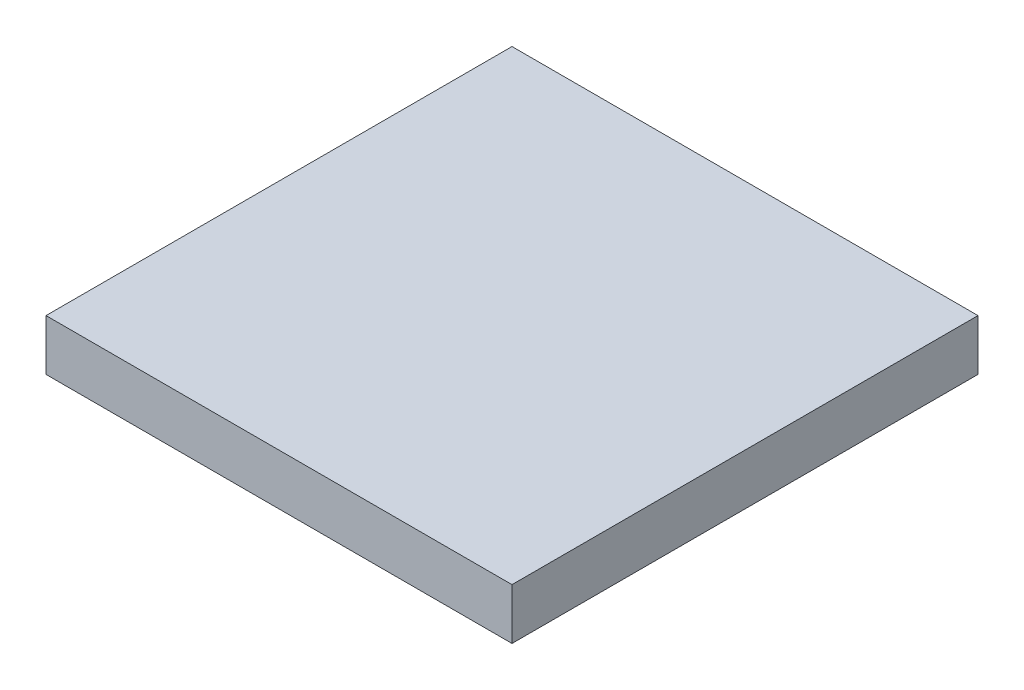
ISO-10303-21;
HEADER;
FILE_DESCRIPTION(('STEP AP214'),'2;1');
FILE_NAME('part.step','',(''),(''),'','','');
FILE_SCHEMA(('AUTOMOTIVE_DESIGN { 1 0 10303 214 1 1 1 1 }'));
ENDSEC;
DATA;
#1=APPLICATION_CONTEXT('core data for automotive mechanical design processes');
#2=APPLICATION_PROTOCOL_DEFINITION('international standard','automotive_design',2000,#1);
#3=PRODUCT_CONTEXT('',#1,'mechanical');
#4=PRODUCT('Part','Part','',(#3));
#5=PRODUCT_RELATED_PRODUCT_CATEGORY('part','',(#4));
#6=PRODUCT_DEFINITION_FORMATION('','',#4);
#7=PRODUCT_DEFINITION_CONTEXT('part definition',#1,'design');
#8=PRODUCT_DEFINITION('design','',#6,#7);
#9=PRODUCT_DEFINITION_SHAPE('','',#8);
#10=(LENGTH_UNIT() NAMED_UNIT(*) SI_UNIT(.MILLI.,.METRE.));
#11=(NAMED_UNIT(*) PLANE_ANGLE_UNIT() SI_UNIT($,.RADIAN.));
#12=(NAMED_UNIT(*) SI_UNIT($,.STERADIAN.) SOLID_ANGLE_UNIT());
#13=UNCERTAINTY_MEASURE_WITH_UNIT(LENGTH_MEASURE(1.E-05),#10,'distance_accuracy_value','');
#14=(GEOMETRIC_REPRESENTATION_CONTEXT(3) GLOBAL_UNCERTAINTY_ASSIGNED_CONTEXT((#13)) GLOBAL_UNIT_ASSIGNED_CONTEXT((#10,
#11,#12)) REPRESENTATION_CONTEXT('',''));
#15=CARTESIAN_POINT('',(0.,0.,0.));
#16=DIRECTION('',(0.,0.,1.));
#17=DIRECTION('',(1.,0.,0.));
#18=AXIS2_PLACEMENT_3D('',#15,#16,#17);
#19=CARTESIAN_POINT('',(-50.8,-5.55625,50.8));
#20=DIRECTION('',(1.,0.,0.));
#21=DIRECTION('',(0.,0.,-1.));
#22=AXIS2_PLACEMENT_3D('',#19,#20,#21);
#23=PLANE('',#22);
#24=DIRECTION('',(0.,-1.,0.));
#25=VECTOR('',#24,1.);
#26=CARTESIAN_POINT('',(-50.8,-5.55625,-50.8));
#27=LINE('',#26,#25);
#28=CARTESIAN_POINT('',(-50.8,5.55625,-50.8));
#29=VERTEX_POINT('',#28);
#30=CARTESIAN_POINT('',(-50.8,-5.55625,-50.8));
#31=VERTEX_POINT('',#30);
#32=EDGE_CURVE('E106',#29,#31,#27,.T.);
#33=ORIENTED_EDGE('',*,*,#32,.T.);
#34=DIRECTION('',(0.,0.,-1.));
#35=VECTOR('',#34,1.);
#36=CARTESIAN_POINT('',(-50.8,-5.55625,50.8));
#37=LINE('',#36,#35);
#38=CARTESIAN_POINT('',(-50.8,-5.55625,50.8));
#39=VERTEX_POINT('',#38);
#40=EDGE_CURVE('E11',#39,#31,#37,.T.);
#41=ORIENTED_EDGE('',*,*,#40,.F.);
#42=DIRECTION('',(0.,-1.,0.));
#43=VECTOR('',#42,1.);
#44=CARTESIAN_POINT('',(-50.8,-5.55625,50.8));
#45=LINE('',#44,#43);
#46=CARTESIAN_POINT('',(-50.8,5.55625,50.8));
#47=VERTEX_POINT('',#46);
#48=EDGE_CURVE('E94',#47,#39,#45,.T.);
#49=ORIENTED_EDGE('',*,*,#48,.F.);
#50=DIRECTION('',(0.,0.,-1.));
#51=VECTOR('',#50,1.);
#52=CARTESIAN_POINT('',(-50.8,5.55625,50.8));
#53=LINE('',#52,#51);
#54=EDGE_CURVE('E102',#47,#29,#53,.T.);
#55=ORIENTED_EDGE('',*,*,#54,.T.);
#56=EDGE_LOOP('',(#33,#41,#49,#55));
#57=FACE_BOUND('',#56,.T.);
#58=ADVANCED_FACE('F43',(#57),#23,.F.);
#59=CARTESIAN_POINT('',(50.8,-5.55625,50.8));
#60=DIRECTION('',(0.,1.,0.));
#61=DIRECTION('',(0.,0.,1.));
#62=AXIS2_PLACEMENT_3D('',#59,#60,#61);
#63=PLANE('',#62);
#64=DIRECTION('',(1.,0.,0.));
#65=VECTOR('',#64,1.);
#66=CARTESIAN_POINT('',(50.8,-5.55625,-50.8));
#67=LINE('',#66,#65);
#68=CARTESIAN_POINT('',(50.8,-5.55625,-50.8));
#69=VERTEX_POINT('',#68);
#70=EDGE_CURVE('E98',#31,#69,#67,.T.);
#71=ORIENTED_EDGE('',*,*,#70,.T.);
#72=DIRECTION('',(0.,0.,-1.));
#73=VECTOR('',#72,1.);
#74=CARTESIAN_POINT('',(50.8,-5.55625,50.8));
#75=LINE('',#74,#73);
#76=CARTESIAN_POINT('',(50.8,-5.55625,50.8));
#77=VERTEX_POINT('',#76);
#78=EDGE_CURVE('E51',#77,#69,#75,.T.);
#79=ORIENTED_EDGE('',*,*,#78,.F.);
#80=DIRECTION('',(1.,0.,0.));
#81=VECTOR('',#80,1.);
#82=CARTESIAN_POINT('',(50.8,-5.55625,50.8));
#83=LINE('',#82,#81);
#84=EDGE_CURVE('E89',#39,#77,#83,.T.);
#85=ORIENTED_EDGE('',*,*,#84,.F.);
#86=ORIENTED_EDGE('',*,*,#40,.T.);
#87=EDGE_LOOP('',(#71,#79,#85,#86));
#88=FACE_BOUND('',#87,.T.);
#89=ADVANCED_FACE('F97',(#88),#63,.F.);
#90=CARTESIAN_POINT('',(50.8,5.55625,50.8));
#91=DIRECTION('',(-1.,0.,0.));
#92=DIRECTION('',(0.,0.,1.));
#93=AXIS2_PLACEMENT_3D('',#90,#91,#92);
#94=PLANE('',#93);
#95=DIRECTION('',(0.,1.,0.));
#96=VECTOR('',#95,1.);
#97=CARTESIAN_POINT('',(50.8,5.55625,-50.8));
#98=LINE('',#97,#96);
#99=CARTESIAN_POINT('',(50.8,5.55625,-50.8));
#100=VERTEX_POINT('',#99);
#101=EDGE_CURVE('E76',#69,#100,#98,.T.);
#102=ORIENTED_EDGE('',*,*,#101,.T.);
#103=DIRECTION('',(0.,0.,-1.));
#104=VECTOR('',#103,1.);
#105=CARTESIAN_POINT('',(50.8,5.55625,50.8));
#106=LINE('',#105,#104);
#107=CARTESIAN_POINT('',(50.8,5.55625,50.8));
#108=VERTEX_POINT('',#107);
#109=EDGE_CURVE('E99',#108,#100,#106,.T.);
#110=ORIENTED_EDGE('',*,*,#109,.F.);
#111=DIRECTION('',(0.,1.,0.));
#112=VECTOR('',#111,1.);
#113=CARTESIAN_POINT('',(50.8,5.55625,50.8));
#114=LINE('',#113,#112);
#115=EDGE_CURVE('E92',#77,#108,#114,.T.);
#116=ORIENTED_EDGE('',*,*,#115,.F.);
#117=ORIENTED_EDGE('',*,*,#78,.T.);
#118=EDGE_LOOP('',(#102,#110,#116,#117));
#119=FACE_BOUND('',#118,.T.);
#120=ADVANCED_FACE('F100',(#119),#94,.F.);
#121=CARTESIAN_POINT('',(-50.8,5.55625,50.8));
#122=DIRECTION('',(0.,-1.,0.));
#123=DIRECTION('',(0.,0.,-1.));
#124=AXIS2_PLACEMENT_3D('',#121,#122,#123);
#125=PLANE('',#124);
#126=DIRECTION('',(-1.,0.,0.));
#127=VECTOR('',#126,1.);
#128=CARTESIAN_POINT('',(-50.8,5.55625,-50.8));
#129=LINE('',#128,#127);
#130=EDGE_CURVE('E82',#100,#29,#129,.T.);
#131=ORIENTED_EDGE('',*,*,#130,.T.);
#132=ORIENTED_EDGE('',*,*,#54,.F.);
#133=DIRECTION('',(-1.,0.,0.));
#134=VECTOR('',#133,1.);
#135=CARTESIAN_POINT('',(-50.8,5.55625,50.8));
#136=LINE('',#135,#134);
#137=EDGE_CURVE('E59',#108,#47,#136,.T.);
#138=ORIENTED_EDGE('',*,*,#137,.F.);
#139=ORIENTED_EDGE('',*,*,#109,.T.);
#140=EDGE_LOOP('',(#131,#132,#138,#139));
#141=FACE_BOUND('',#140,.T.);
#142=ADVANCED_FACE('F113',(#141),#125,.F.);
#143=CARTESIAN_POINT('',(0.,0.,50.8));
#144=DIRECTION('',(0.,0.,-1.));
#145=DIRECTION('',(-1.,0.,0.));
#146=AXIS2_PLACEMENT_3D('',#143,#144,#145);
#147=PLANE('',#146);
#148=ORIENTED_EDGE('',*,*,#48,.T.);
#149=ORIENTED_EDGE('',*,*,#84,.T.);
#150=ORIENTED_EDGE('',*,*,#115,.T.);
#151=ORIENTED_EDGE('',*,*,#137,.T.);
#152=EDGE_LOOP('',(#148,#149,#150,#151));
#153=FACE_BOUND('',#152,.T.);
#154=ADVANCED_FACE('F90',(#153),#147,.F.);
#155=CARTESIAN_POINT('',(0.,0.,-50.8));
#156=DIRECTION('',(0.,0.,-1.));
#157=DIRECTION('',(-1.,0.,0.));
#158=AXIS2_PLACEMENT_3D('',#155,#156,#157);
#159=PLANE('',#158);
#160=ORIENTED_EDGE('',*,*,#32,.F.);
#161=ORIENTED_EDGE('',*,*,#130,.F.);
#162=ORIENTED_EDGE('',*,*,#101,.F.);
#163=ORIENTED_EDGE('',*,*,#70,.F.);
#164=EDGE_LOOP('',(#160,#161,#162,#163));
#165=FACE_BOUND('',#164,.T.);
#166=ADVANCED_FACE('F116',(#165),#159,.T.);
#167=CLOSED_SHELL('',(#58,#89,#120,#142,#154,#166));
#168=MANIFOLD_SOLID_BREP('B2',#167);
#169=ADVANCED_BREP_SHAPE_REPRESENTATION('',(#18,#168),#14);
#170=SHAPE_DEFINITION_REPRESENTATION(#9,#169);
ENDSEC;
END-ISO-10303-21;
